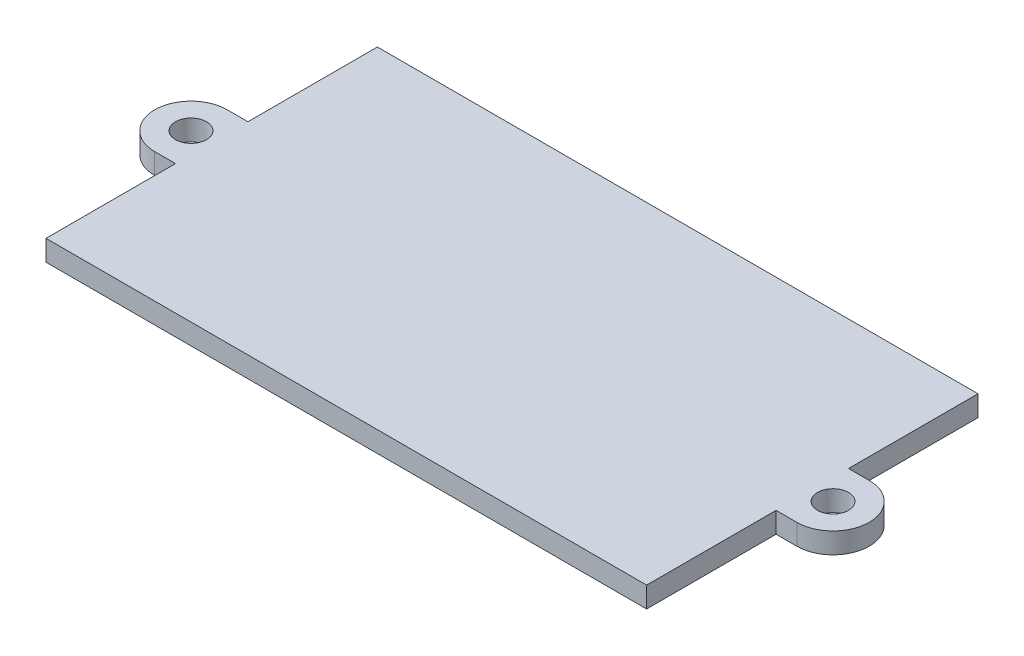
ISO-10303-21;
HEADER;
FILE_DESCRIPTION(('STEP AP214'),'2;1');
FILE_NAME('part.step','',(''),(''),'','','');
FILE_SCHEMA(('AUTOMOTIVE_DESIGN { 1 0 10303 214 1 1 1 1 }'));
ENDSEC;
DATA;
#1=APPLICATION_CONTEXT('core data for automotive mechanical design processes');
#2=APPLICATION_PROTOCOL_DEFINITION('international standard','automotive_design',2000,#1);
#3=PRODUCT_CONTEXT('',#1,'mechanical');
#4=PRODUCT('Part','Part','',(#3));
#5=PRODUCT_RELATED_PRODUCT_CATEGORY('part','',(#4));
#6=PRODUCT_DEFINITION_FORMATION('','',#4);
#7=PRODUCT_DEFINITION_CONTEXT('part definition',#1,'design');
#8=PRODUCT_DEFINITION('design','',#6,#7);
#9=PRODUCT_DEFINITION_SHAPE('','',#8);
#10=(LENGTH_UNIT() NAMED_UNIT(*) SI_UNIT(.MILLI.,.METRE.));
#11=(NAMED_UNIT(*) PLANE_ANGLE_UNIT() SI_UNIT($,.RADIAN.));
#12=(NAMED_UNIT(*) SI_UNIT($,.STERADIAN.) SOLID_ANGLE_UNIT());
#13=UNCERTAINTY_MEASURE_WITH_UNIT(LENGTH_MEASURE(1.E-05),#10,'distance_accuracy_value','');
#14=(GEOMETRIC_REPRESENTATION_CONTEXT(3) GLOBAL_UNCERTAINTY_ASSIGNED_CONTEXT((#13)) GLOBAL_UNIT_ASSIGNED_CONTEXT((#10,
#11,#12)) REPRESENTATION_CONTEXT('',''));
#15=CARTESIAN_POINT('',(0.,0.,0.));
#16=DIRECTION('',(0.,0.,1.));
#17=DIRECTION('',(1.,0.,0.));
#18=AXIS2_PLACEMENT_3D('',#15,#16,#17);
#19=CARTESIAN_POINT('',(-29.,2.,0.));
#20=DIRECTION('',(-1.,0.,0.));
#21=DIRECTION('',(0.,0.,1.));
#22=AXIS2_PLACEMENT_3D('',#19,#20,#21);
#23=PLANE('',#22);
#24=DIRECTION('',(0.,0.,-1.));
#25=VECTOR('',#24,1.);
#26=CARTESIAN_POINT('',(-29.,0.,0.));
#27=LINE('',#26,#25);
#28=CARTESIAN_POINT('',(-29.,0.,16.));
#29=VERTEX_POINT('',#28);
#30=CARTESIAN_POINT('',(-29.,0.,3.5));
#31=VERTEX_POINT('',#30);
#32=EDGE_CURVE('E168',#29,#31,#27,.T.);
#33=ORIENTED_EDGE('',*,*,#32,.F.);
#34=DIRECTION('',(0.,-1.,0.));
#35=VECTOR('',#34,1.);
#36=CARTESIAN_POINT('',(-29.,2.,16.));
#37=LINE('',#36,#35);
#38=CARTESIAN_POINT('',(-29.,2.,16.));
#39=VERTEX_POINT('',#38);
#40=EDGE_CURVE('E11',#39,#29,#37,.T.);
#41=ORIENTED_EDGE('',*,*,#40,.F.);
#42=DIRECTION('',(0.,0.,-1.));
#43=VECTOR('',#42,1.);
#44=CARTESIAN_POINT('',(-29.,2.,0.));
#45=LINE('',#44,#43);
#46=CARTESIAN_POINT('',(-29.,2.,3.5));
#47=VERTEX_POINT('',#46);
#48=EDGE_CURVE('E157',#39,#47,#45,.T.);
#49=ORIENTED_EDGE('',*,*,#48,.T.);
#50=DIRECTION('',(0.,-1.,0.));
#51=VECTOR('',#50,1.);
#52=CARTESIAN_POINT('',(-29.,2.,3.5));
#53=LINE('',#52,#51);
#54=EDGE_CURVE('E103',#47,#31,#53,.T.);
#55=ORIENTED_EDGE('',*,*,#54,.T.);
#56=EDGE_LOOP('',(#33,#41,#49,#55));
#57=FACE_BOUND('',#56,.T.);
#58=ADVANCED_FACE('F40',(#57),#23,.T.);
#59=CARTESIAN_POINT('',(0.,2.,16.));
#60=DIRECTION('',(0.,0.,1.));
#61=DIRECTION('',(1.,0.,0.));
#62=AXIS2_PLACEMENT_3D('',#59,#60,#61);
#63=PLANE('',#62);
#64=DIRECTION('',(-1.,0.,0.));
#65=VECTOR('',#64,1.);
#66=CARTESIAN_POINT('',(0.,0.,16.));
#67=LINE('',#66,#65);
#68=CARTESIAN_POINT('',(29.,0.,16.));
#69=VERTEX_POINT('',#68);
#70=EDGE_CURVE('E171',#69,#29,#67,.T.);
#71=ORIENTED_EDGE('',*,*,#70,.F.);
#72=DIRECTION('',(0.,-1.,0.));
#73=VECTOR('',#72,1.);
#74=CARTESIAN_POINT('',(29.,2.,16.));
#75=LINE('',#74,#73);
#76=CARTESIAN_POINT('',(29.,2.,16.));
#77=VERTEX_POINT('',#76);
#78=EDGE_CURVE('E49',#77,#69,#75,.T.);
#79=ORIENTED_EDGE('',*,*,#78,.F.);
#80=DIRECTION('',(-1.,0.,0.));
#81=VECTOR('',#80,1.);
#82=CARTESIAN_POINT('',(0.,2.,16.));
#83=LINE('',#82,#81);
#84=EDGE_CURVE('E238',#77,#39,#83,.T.);
#85=ORIENTED_EDGE('',*,*,#84,.T.);
#86=ORIENTED_EDGE('',*,*,#40,.T.);
#87=EDGE_LOOP('',(#71,#79,#85,#86));
#88=FACE_BOUND('',#87,.T.);
#89=ADVANCED_FACE('F42',(#88),#63,.T.);
#90=CARTESIAN_POINT('',(29.,2.,0.));
#91=DIRECTION('',(1.,0.,0.));
#92=DIRECTION('',(0.,0.,-1.));
#93=AXIS2_PLACEMENT_3D('',#90,#91,#92);
#94=PLANE('',#93);
#95=DIRECTION('',(0.,0.,1.));
#96=VECTOR('',#95,1.);
#97=CARTESIAN_POINT('',(29.,0.,0.));
#98=LINE('',#97,#96);
#99=CARTESIAN_POINT('',(29.,0.,3.5));
#100=VERTEX_POINT('',#99);
#101=EDGE_CURVE('E175',#100,#69,#98,.T.);
#102=ORIENTED_EDGE('',*,*,#101,.F.);
#103=DIRECTION('',(0.,-1.,0.));
#104=VECTOR('',#103,1.);
#105=CARTESIAN_POINT('',(29.,2.,3.5));
#106=LINE('',#105,#104);
#107=CARTESIAN_POINT('',(29.,2.,3.5));
#108=VERTEX_POINT('',#107);
#109=EDGE_CURVE('E214',#108,#100,#106,.T.);
#110=ORIENTED_EDGE('',*,*,#109,.F.);
#111=DIRECTION('',(0.,0.,1.));
#112=VECTOR('',#111,1.);
#113=CARTESIAN_POINT('',(29.,2.,0.));
#114=LINE('',#113,#112);
#115=EDGE_CURVE('E221',#108,#77,#114,.T.);
#116=ORIENTED_EDGE('',*,*,#115,.T.);
#117=ORIENTED_EDGE('',*,*,#78,.T.);
#118=EDGE_LOOP('',(#102,#110,#116,#117));
#119=FACE_BOUND('',#118,.T.);
#120=ADVANCED_FACE('F219',(#119),#94,.T.);
#121=CARTESIAN_POINT('',(0.,2.,3.5));
#122=DIRECTION('',(0.,0.,1.));
#123=DIRECTION('',(1.,0.,0.));
#124=AXIS2_PLACEMENT_3D('',#121,#122,#123);
#125=PLANE('',#124);
#126=DIRECTION('',(-1.,0.,0.));
#127=VECTOR('',#126,1.);
#128=CARTESIAN_POINT('',(0.,0.,3.5));
#129=LINE('',#128,#127);
#130=CARTESIAN_POINT('',(31.,0.,3.5));
#131=VERTEX_POINT('',#130);
#132=EDGE_CURVE('E178',#131,#100,#129,.T.);
#133=ORIENTED_EDGE('',*,*,#132,.F.);
#134=DIRECTION('',(0.,-1.,0.));
#135=VECTOR('',#134,1.);
#136=CARTESIAN_POINT('',(31.,2.,3.5));
#137=LINE('',#136,#135);
#138=CARTESIAN_POINT('',(31.,2.,3.5));
#139=VERTEX_POINT('',#138);
#140=EDGE_CURVE('E212',#139,#131,#137,.T.);
#141=ORIENTED_EDGE('',*,*,#140,.F.);
#142=DIRECTION('',(-1.,0.,0.));
#143=VECTOR('',#142,1.);
#144=CARTESIAN_POINT('',(0.,2.,3.5));
#145=LINE('',#144,#143);
#146=EDGE_CURVE('E235',#139,#108,#145,.T.);
#147=ORIENTED_EDGE('',*,*,#146,.T.);
#148=ORIENTED_EDGE('',*,*,#109,.T.);
#149=EDGE_LOOP('',(#133,#141,#147,#148));
#150=FACE_BOUND('',#149,.T.);
#151=ADVANCED_FACE('F232',(#150),#125,.T.);
#152=CARTESIAN_POINT('',(31.,2.,0.));
#153=DIRECTION('',(0.,-1.,0.));
#154=DIRECTION('',(0.,0.,-1.));
#155=AXIS2_PLACEMENT_3D('',#152,#153,#154);
#156=CYLINDRICAL_SURFACE('',#155,3.5);
#157=CARTESIAN_POINT('',(31.,0.,0.));
#158=DIRECTION('',(0.,1.,0.));
#159=DIRECTION('',(0.,0.,1.));
#160=AXIS2_PLACEMENT_3D('',#157,#158,#159);
#161=CIRCLE('',#160,3.5);
#162=CARTESIAN_POINT('',(31.,0.,-3.5));
#163=VERTEX_POINT('',#162);
#164=EDGE_CURVE('E182',#163,#131,#161,.F.);
#165=ORIENTED_EDGE('',*,*,#164,.F.);
#166=DIRECTION('',(0.,-1.,0.));
#167=VECTOR('',#166,1.);
#168=CARTESIAN_POINT('',(31.,2.,-3.5));
#169=LINE('',#168,#167);
#170=CARTESIAN_POINT('',(31.,2.,-3.5));
#171=VERTEX_POINT('',#170);
#172=EDGE_CURVE('E210',#171,#163,#169,.T.);
#173=ORIENTED_EDGE('',*,*,#172,.F.);
#174=CARTESIAN_POINT('',(31.,2.,0.));
#175=DIRECTION('',(0.,1.,0.));
#176=DIRECTION('',(0.,0.,1.));
#177=AXIS2_PLACEMENT_3D('',#174,#175,#176);
#178=CIRCLE('',#177,3.5);
#179=EDGE_CURVE('E241',#171,#139,#178,.F.);
#180=ORIENTED_EDGE('',*,*,#179,.T.);
#181=ORIENTED_EDGE('',*,*,#140,.T.);
#182=EDGE_LOOP('',(#165,#173,#180,#181));
#183=FACE_BOUND('',#182,.T.);
#184=ADVANCED_FACE('F253',(#183),#156,.T.);
#185=CARTESIAN_POINT('',(0.,2.,-3.5));
#186=DIRECTION('',(0.,0.,1.));
#187=DIRECTION('',(1.,0.,0.));
#188=AXIS2_PLACEMENT_3D('',#185,#186,#187);
#189=PLANE('',#188);
#190=DIRECTION('',(-1.,0.,0.));
#191=VECTOR('',#190,1.);
#192=CARTESIAN_POINT('',(0.,0.,-3.5));
#193=LINE('',#192,#191);
#194=CARTESIAN_POINT('',(29.,0.,-3.5));
#195=VERTEX_POINT('',#194);
#196=EDGE_CURVE('E185',#163,#195,#193,.T.);
#197=ORIENTED_EDGE('',*,*,#196,.T.);
#198=DIRECTION('',(0.,-1.,0.));
#199=VECTOR('',#198,1.);
#200=CARTESIAN_POINT('',(29.,2.,-3.5));
#201=LINE('',#200,#199);
#202=CARTESIAN_POINT('',(29.,2.,-3.5));
#203=VERTEX_POINT('',#202);
#204=EDGE_CURVE('E208',#203,#195,#201,.T.);
#205=ORIENTED_EDGE('',*,*,#204,.F.);
#206=DIRECTION('',(-1.,0.,0.));
#207=VECTOR('',#206,1.);
#208=CARTESIAN_POINT('',(0.,2.,-3.5));
#209=LINE('',#208,#207);
#210=EDGE_CURVE('E245',#171,#203,#209,.T.);
#211=ORIENTED_EDGE('',*,*,#210,.F.);
#212=ORIENTED_EDGE('',*,*,#172,.T.);
#213=EDGE_LOOP('',(#197,#205,#211,#212));
#214=FACE_BOUND('',#213,.T.);
#215=ADVANCED_FACE('F255',(#214),#189,.F.);
#216=CARTESIAN_POINT('',(29.,0.,-16.));
#217=VERTEX_POINT('',#216);
#218=EDGE_CURVE('E179',#217,#195,#98,.T.);
#219=ORIENTED_EDGE('',*,*,#218,.F.);
#220=DIRECTION('',(0.,-1.,0.));
#221=VECTOR('',#220,1.);
#222=CARTESIAN_POINT('',(29.,2.,-16.));
#223=LINE('',#222,#221);
#224=CARTESIAN_POINT('',(29.,2.,-16.));
#225=VERTEX_POINT('',#224);
#226=EDGE_CURVE('E206',#225,#217,#223,.T.);
#227=ORIENTED_EDGE('',*,*,#226,.F.);
#228=EDGE_CURVE('E240',#225,#203,#114,.T.);
#229=ORIENTED_EDGE('',*,*,#228,.T.);
#230=ORIENTED_EDGE('',*,*,#204,.T.);
#231=EDGE_LOOP('',(#219,#227,#229,#230));
#232=FACE_BOUND('',#231,.T.);
#233=ADVANCED_FACE('F258',(#232),#94,.T.);
#234=CARTESIAN_POINT('',(0.,2.,-16.));
#235=DIRECTION('',(0.,0.,-1.));
#236=DIRECTION('',(-1.,0.,0.));
#237=AXIS2_PLACEMENT_3D('',#234,#235,#236);
#238=PLANE('',#237);
#239=DIRECTION('',(1.,0.,0.));
#240=VECTOR('',#239,1.);
#241=CARTESIAN_POINT('',(0.,0.,-16.));
#242=LINE('',#241,#240);
#243=CARTESIAN_POINT('',(-29.,0.,-16.));
#244=VERTEX_POINT('',#243);
#245=EDGE_CURVE('E188',#244,#217,#242,.T.);
#246=ORIENTED_EDGE('',*,*,#245,.F.);
#247=DIRECTION('',(0.,-1.,0.));
#248=VECTOR('',#247,1.);
#249=CARTESIAN_POINT('',(-29.,2.,-16.));
#250=LINE('',#249,#248);
#251=CARTESIAN_POINT('',(-29.,2.,-16.));
#252=VERTEX_POINT('',#251);
#253=EDGE_CURVE('E204',#252,#244,#250,.T.);
#254=ORIENTED_EDGE('',*,*,#253,.F.);
#255=DIRECTION('',(1.,0.,0.));
#256=VECTOR('',#255,1.);
#257=CARTESIAN_POINT('',(0.,2.,-16.));
#258=LINE('',#257,#256);
#259=EDGE_CURVE('E155',#252,#225,#258,.T.);
#260=ORIENTED_EDGE('',*,*,#259,.T.);
#261=ORIENTED_EDGE('',*,*,#226,.T.);
#262=EDGE_LOOP('',(#246,#254,#260,#261));
#263=FACE_BOUND('',#262,.T.);
#264=ADVANCED_FACE('F263',(#263),#238,.T.);
#265=CARTESIAN_POINT('',(-29.,0.,-3.5));
#266=VERTEX_POINT('',#265);
#267=EDGE_CURVE('E172',#266,#244,#27,.T.);
#268=ORIENTED_EDGE('',*,*,#267,.F.);
#269=DIRECTION('',(0.,-1.,0.));
#270=VECTOR('',#269,1.);
#271=CARTESIAN_POINT('',(-29.,2.,-3.5));
#272=LINE('',#271,#270);
#273=CARTESIAN_POINT('',(-29.,2.,-3.5));
#274=VERTEX_POINT('',#273);
#275=EDGE_CURVE('E142',#274,#266,#272,.T.);
#276=ORIENTED_EDGE('',*,*,#275,.F.);
#277=EDGE_CURVE('E153',#274,#252,#45,.T.);
#278=ORIENTED_EDGE('',*,*,#277,.T.);
#279=ORIENTED_EDGE('',*,*,#253,.T.);
#280=EDGE_LOOP('',(#268,#276,#278,#279));
#281=FACE_BOUND('',#280,.T.);
#282=ADVANCED_FACE('F265',(#281),#23,.T.);
#283=CARTESIAN_POINT('',(0.,2.,-3.5));
#284=DIRECTION('',(0.,0.,-1.));
#285=DIRECTION('',(-1.,0.,0.));
#286=AXIS2_PLACEMENT_3D('',#283,#284,#285);
#287=PLANE('',#286);
#288=DIRECTION('',(1.,0.,0.));
#289=VECTOR('',#288,1.);
#290=CARTESIAN_POINT('',(0.,0.,-3.5));
#291=LINE('',#290,#289);
#292=CARTESIAN_POINT('',(-31.,0.,-3.5));
#293=VERTEX_POINT('',#292);
#294=EDGE_CURVE('E141',#293,#266,#291,.T.);
#295=ORIENTED_EDGE('',*,*,#294,.F.);
#296=DIRECTION('',(0.,-1.,0.));
#297=VECTOR('',#296,1.);
#298=CARTESIAN_POINT('',(-31.,2.,-3.5));
#299=LINE('',#298,#297);
#300=CARTESIAN_POINT('',(-31.,2.,-3.5));
#301=VERTEX_POINT('',#300);
#302=EDGE_CURVE('E135',#301,#293,#299,.T.);
#303=ORIENTED_EDGE('',*,*,#302,.F.);
#304=DIRECTION('',(1.,0.,0.));
#305=VECTOR('',#304,1.);
#306=CARTESIAN_POINT('',(0.,2.,-3.5));
#307=LINE('',#306,#305);
#308=EDGE_CURVE('E139',#301,#274,#307,.T.);
#309=ORIENTED_EDGE('',*,*,#308,.T.);
#310=ORIENTED_EDGE('',*,*,#275,.T.);
#311=EDGE_LOOP('',(#295,#303,#309,#310));
#312=FACE_BOUND('',#311,.T.);
#313=ADVANCED_FACE('F137',(#312),#287,.T.);
#314=CARTESIAN_POINT('',(-31.,2.,0.));
#315=DIRECTION('',(0.,-1.,0.));
#316=DIRECTION('',(0.,0.,-1.));
#317=AXIS2_PLACEMENT_3D('',#314,#315,#316);
#318=CYLINDRICAL_SURFACE('',#317,3.5);
#319=CARTESIAN_POINT('',(-31.,0.,0.));
#320=DIRECTION('',(0.,1.,0.));
#321=DIRECTION('',(0.,0.,1.));
#322=AXIS2_PLACEMENT_3D('',#319,#320,#321);
#323=CIRCLE('',#322,3.5);
#324=CARTESIAN_POINT('',(-31.,0.,3.5));
#325=VERTEX_POINT('',#324);
#326=EDGE_CURVE('E96',#293,#325,#323,.T.);
#327=ORIENTED_EDGE('',*,*,#326,.T.);
#328=DIRECTION('',(0.,-1.,0.));
#329=VECTOR('',#328,1.);
#330=CARTESIAN_POINT('',(-31.,2.,3.5));
#331=LINE('',#330,#329);
#332=CARTESIAN_POINT('',(-31.,2.,3.5));
#333=VERTEX_POINT('',#332);
#334=EDGE_CURVE('E143',#333,#325,#331,.T.);
#335=ORIENTED_EDGE('',*,*,#334,.F.);
#336=CARTESIAN_POINT('',(-31.,2.,0.));
#337=DIRECTION('',(0.,1.,0.));
#338=DIRECTION('',(0.,0.,1.));
#339=AXIS2_PLACEMENT_3D('',#336,#337,#338);
#340=CIRCLE('',#339,3.5);
#341=EDGE_CURVE('E145',#301,#333,#340,.T.);
#342=ORIENTED_EDGE('',*,*,#341,.F.);
#343=ORIENTED_EDGE('',*,*,#302,.T.);
#344=EDGE_LOOP('',(#327,#335,#342,#343));
#345=FACE_BOUND('',#344,.T.);
#346=ADVANCED_FACE('F146',(#345),#318,.T.);
#347=CARTESIAN_POINT('',(31.,2.,0.));
#348=DIRECTION('',(0.,-1.,0.));
#349=DIRECTION('',(0.,0.,-1.));
#350=AXIS2_PLACEMENT_3D('',#347,#348,#349);
#351=CYLINDRICAL_SURFACE('',#350,1.5);
#352=CARTESIAN_POINT('',(31.,2.,0.));
#353=DIRECTION('',(0.,1.,0.));
#354=DIRECTION('',(0.,0.,1.));
#355=AXIS2_PLACEMENT_3D('',#352,#353,#354);
#356=CIRCLE('',#355,1.5);
#357=CARTESIAN_POINT('',(31.,2.,1.5));
#358=VERTEX_POINT('',#357);
#359=EDGE_CURVE('E162',#358,#358,#356,.F.);
#360=ORIENTED_EDGE('',*,*,#359,.F.);
#361=EDGE_LOOP('',(#360));
#362=FACE_BOUND('',#361,.T.);
#363=CARTESIAN_POINT('',(31.,0.,0.));
#364=DIRECTION('',(0.,1.,0.));
#365=DIRECTION('',(0.,0.,1.));
#366=AXIS2_PLACEMENT_3D('',#363,#364,#365);
#367=CIRCLE('',#366,1.5);
#368=CARTESIAN_POINT('',(31.,0.,1.5));
#369=VERTEX_POINT('',#368);
#370=EDGE_CURVE('E195',#369,#369,#367,.F.);
#371=ORIENTED_EDGE('',*,*,#370,.T.);
#372=EDGE_LOOP('',(#371));
#373=FACE_BOUND('',#372,.T.);
#374=ADVANCED_FACE('F356',(#362,#373),#351,.F.);
#375=CARTESIAN_POINT('',(0.,2.,3.5));
#376=DIRECTION('',(0.,0.,-1.));
#377=DIRECTION('',(-1.,0.,0.));
#378=AXIS2_PLACEMENT_3D('',#375,#376,#377);
#379=PLANE('',#378);
#380=DIRECTION('',(1.,0.,0.));
#381=VECTOR('',#380,1.);
#382=CARTESIAN_POINT('',(0.,0.,3.5));
#383=LINE('',#382,#381);
#384=EDGE_CURVE('E193',#325,#31,#383,.T.);
#385=ORIENTED_EDGE('',*,*,#384,.T.);
#386=ORIENTED_EDGE('',*,*,#54,.F.);
#387=DIRECTION('',(1.,0.,0.));
#388=VECTOR('',#387,1.);
#389=CARTESIAN_POINT('',(0.,2.,3.5));
#390=LINE('',#389,#388);
#391=EDGE_CURVE('E57',#333,#47,#390,.T.);
#392=ORIENTED_EDGE('',*,*,#391,.F.);
#393=ORIENTED_EDGE('',*,*,#334,.T.);
#394=EDGE_LOOP('',(#385,#386,#392,#393));
#395=FACE_BOUND('',#394,.T.);
#396=ADVANCED_FACE('F268',(#395),#379,.F.);
#397=CARTESIAN_POINT('',(-31.,2.,0.));
#398=DIRECTION('',(0.,-1.,0.));
#399=DIRECTION('',(0.,0.,-1.));
#400=AXIS2_PLACEMENT_3D('',#397,#398,#399);
#401=CYLINDRICAL_SURFACE('',#400,1.5);
#402=CARTESIAN_POINT('',(-31.,2.,0.));
#403=DIRECTION('',(0.,1.,0.));
#404=DIRECTION('',(0.,0.,1.));
#405=AXIS2_PLACEMENT_3D('',#402,#403,#404);
#406=CIRCLE('',#405,1.5);
#407=CARTESIAN_POINT('',(-31.,2.,1.5));
#408=VERTEX_POINT('',#407);
#409=EDGE_CURVE('E165',#408,#408,#406,.T.);
#410=ORIENTED_EDGE('',*,*,#409,.T.);
#411=EDGE_LOOP('',(#410));
#412=FACE_BOUND('',#411,.T.);
#413=CARTESIAN_POINT('',(-31.,0.,0.));
#414=DIRECTION('',(0.,1.,0.));
#415=DIRECTION('',(0.,0.,1.));
#416=AXIS2_PLACEMENT_3D('',#413,#414,#415);
#417=CIRCLE('',#416,1.5);
#418=CARTESIAN_POINT('',(-31.,0.,1.5));
#419=VERTEX_POINT('',#418);
#420=EDGE_CURVE('E198',#419,#419,#417,.T.);
#421=ORIENTED_EDGE('',*,*,#420,.F.);
#422=EDGE_LOOP('',(#421));
#423=FACE_BOUND('',#422,.T.);
#424=ADVANCED_FACE('F312',(#412,#423),#401,.F.);
#425=CARTESIAN_POINT('',(0.,2.,0.));
#426=DIRECTION('',(0.,1.,0.));
#427=DIRECTION('',(0.,0.,1.));
#428=AXIS2_PLACEMENT_3D('',#425,#426,#427);
#429=PLANE('',#428);
#430=ORIENTED_EDGE('',*,*,#48,.F.);
#431=ORIENTED_EDGE('',*,*,#84,.F.);
#432=ORIENTED_EDGE('',*,*,#115,.F.);
#433=ORIENTED_EDGE('',*,*,#146,.F.);
#434=ORIENTED_EDGE('',*,*,#179,.F.);
#435=ORIENTED_EDGE('',*,*,#210,.T.);
#436=ORIENTED_EDGE('',*,*,#228,.F.);
#437=ORIENTED_EDGE('',*,*,#259,.F.);
#438=ORIENTED_EDGE('',*,*,#277,.F.);
#439=ORIENTED_EDGE('',*,*,#308,.F.);
#440=ORIENTED_EDGE('',*,*,#341,.T.);
#441=ORIENTED_EDGE('',*,*,#391,.T.);
#442=EDGE_LOOP('',(#430,#431,#432,#433,#434,#435,#436,#437,#438,#439,#440,#441));
#443=FACE_BOUND('',#442,.T.);
#444=ORIENTED_EDGE('',*,*,#359,.T.);
#445=EDGE_LOOP('',(#444));
#446=FACE_BOUND('',#445,.T.);
#447=ORIENTED_EDGE('',*,*,#409,.F.);
#448=EDGE_LOOP('',(#447));
#449=FACE_BOUND('',#448,.T.);
#450=ADVANCED_FACE('F149',(#443,#446,#449),#429,.T.);
#451=CARTESIAN_POINT('',(0.,0.,0.));
#452=DIRECTION('',(0.,1.,0.));
#453=DIRECTION('',(0.,0.,1.));
#454=AXIS2_PLACEMENT_3D('',#451,#452,#453);
#455=PLANE('',#454);
#456=ORIENTED_EDGE('',*,*,#32,.T.);
#457=ORIENTED_EDGE('',*,*,#384,.F.);
#458=ORIENTED_EDGE('',*,*,#326,.F.);
#459=ORIENTED_EDGE('',*,*,#294,.T.);
#460=ORIENTED_EDGE('',*,*,#267,.T.);
#461=ORIENTED_EDGE('',*,*,#245,.T.);
#462=ORIENTED_EDGE('',*,*,#218,.T.);
#463=ORIENTED_EDGE('',*,*,#196,.F.);
#464=ORIENTED_EDGE('',*,*,#164,.T.);
#465=ORIENTED_EDGE('',*,*,#132,.T.);
#466=ORIENTED_EDGE('',*,*,#101,.T.);
#467=ORIENTED_EDGE('',*,*,#70,.T.);
#468=EDGE_LOOP('',(#456,#457,#458,#459,#460,#461,#462,#463,#464,#465,#466,#467));
#469=FACE_BOUND('',#468,.T.);
#470=ORIENTED_EDGE('',*,*,#370,.F.);
#471=EDGE_LOOP('',(#470));
#472=FACE_BOUND('',#471,.T.);
#473=ORIENTED_EDGE('',*,*,#420,.T.);
#474=EDGE_LOOP('',(#473));
#475=FACE_BOUND('',#474,.T.);
#476=ADVANCED_FACE('F226',(#469,#472,#475),#455,.F.);
#477=CLOSED_SHELL('',(#58,#89,#120,#151,#184,#215,#233,#264,#282,#313,#346,#374,#396,#424,#450,#476));
#478=MANIFOLD_SOLID_BREP('B2',#477);
#479=ADVANCED_BREP_SHAPE_REPRESENTATION('',(#18,#478),#14);
#480=SHAPE_DEFINITION_REPRESENTATION(#9,#479);
ENDSEC;
END-ISO-10303-21;
